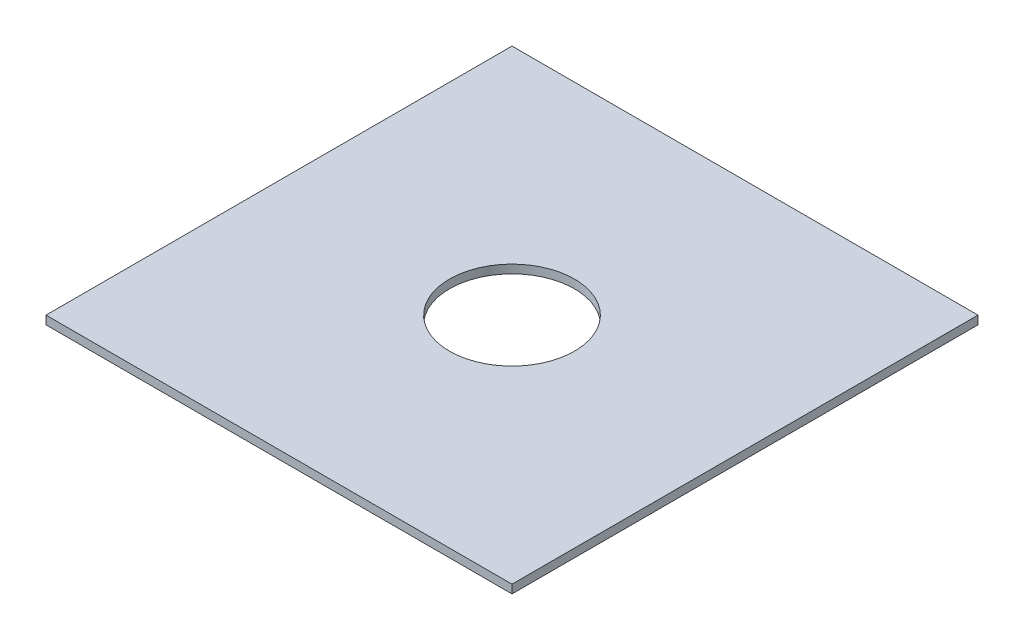
ISO-10303-21;
HEADER;
FILE_DESCRIPTION(('STEP AP214'),'2;1');
FILE_NAME('part.step','',(''),(''),'','','');
FILE_SCHEMA(('AUTOMOTIVE_DESIGN { 1 0 10303 214 1 1 1 1 }'));
ENDSEC;
DATA;
#1=APPLICATION_CONTEXT('core data for automotive mechanical design processes');
#2=APPLICATION_PROTOCOL_DEFINITION('international standard','automotive_design',2000,#1);
#3=PRODUCT_CONTEXT('',#1,'mechanical');
#4=PRODUCT('Part','Part','',(#3));
#5=PRODUCT_RELATED_PRODUCT_CATEGORY('part','',(#4));
#6=PRODUCT_DEFINITION_FORMATION('','',#4);
#7=PRODUCT_DEFINITION_CONTEXT('part definition',#1,'design');
#8=PRODUCT_DEFINITION('design','',#6,#7);
#9=PRODUCT_DEFINITION_SHAPE('','',#8);
#10=(LENGTH_UNIT() NAMED_UNIT(*) SI_UNIT(.MILLI.,.METRE.));
#11=(NAMED_UNIT(*) PLANE_ANGLE_UNIT() SI_UNIT($,.RADIAN.));
#12=(NAMED_UNIT(*) SI_UNIT($,.STERADIAN.) SOLID_ANGLE_UNIT());
#13=UNCERTAINTY_MEASURE_WITH_UNIT(LENGTH_MEASURE(1.E-05),#10,'distance_accuracy_value','');
#14=(GEOMETRIC_REPRESENTATION_CONTEXT(3) GLOBAL_UNCERTAINTY_ASSIGNED_CONTEXT((#13)) GLOBAL_UNIT_ASSIGNED_CONTEXT((#10,
#11,#12)) REPRESENTATION_CONTEXT('',''));
#15=CARTESIAN_POINT('',(0.,0.,0.));
#16=DIRECTION('',(0.,0.,1.));
#17=DIRECTION('',(1.,0.,0.));
#18=AXIS2_PLACEMENT_3D('',#15,#16,#17);
#19=CARTESIAN_POINT('',(55.,2.,-55.));
#20=DIRECTION('',(-1.,0.,0.));
#21=DIRECTION('',(0.,0.,1.));
#22=AXIS2_PLACEMENT_3D('',#19,#20,#21);
#23=PLANE('',#22);
#24=DIRECTION('',(0.,0.,-1.));
#25=VECTOR('',#24,1.);
#26=CARTESIAN_POINT('',(55.,0.,-55.));
#27=LINE('',#26,#25);
#28=CARTESIAN_POINT('',(55.,0.,55.));
#29=VERTEX_POINT('',#28);
#30=CARTESIAN_POINT('',(55.,0.,-55.));
#31=VERTEX_POINT('',#30);
#32=EDGE_CURVE('E107',#29,#31,#27,.T.);
#33=ORIENTED_EDGE('',*,*,#32,.T.);
#34=DIRECTION('',(0.,-1.,0.));
#35=VECTOR('',#34,1.);
#36=CARTESIAN_POINT('',(55.,2.,-55.));
#37=LINE('',#36,#35);
#38=CARTESIAN_POINT('',(55.,2.,-55.));
#39=VERTEX_POINT('',#38);
#40=EDGE_CURVE('E11',#39,#31,#37,.T.);
#41=ORIENTED_EDGE('',*,*,#40,.F.);
#42=DIRECTION('',(0.,0.,-1.));
#43=VECTOR('',#42,1.);
#44=CARTESIAN_POINT('',(55.,2.,-55.));
#45=LINE('',#44,#43);
#46=CARTESIAN_POINT('',(55.,2.,55.));
#47=VERTEX_POINT('',#46);
#48=EDGE_CURVE('E91',#47,#39,#45,.T.);
#49=ORIENTED_EDGE('',*,*,#48,.F.);
#50=DIRECTION('',(0.,-1.,0.));
#51=VECTOR('',#50,1.);
#52=CARTESIAN_POINT('',(55.,2.,55.));
#53=LINE('',#52,#51);
#54=EDGE_CURVE('E103',#47,#29,#53,.T.);
#55=ORIENTED_EDGE('',*,*,#54,.T.);
#56=EDGE_LOOP('',(#33,#41,#49,#55));
#57=FACE_BOUND('',#56,.T.);
#58=ADVANCED_FACE('F39',(#57),#23,.F.);
#59=CARTESIAN_POINT('',(-55.,2.,-55.));
#60=DIRECTION('',(0.,0.,1.));
#61=DIRECTION('',(1.,0.,0.));
#62=AXIS2_PLACEMENT_3D('',#59,#60,#61);
#63=PLANE('',#62);
#64=DIRECTION('',(-1.,0.,0.));
#65=VECTOR('',#64,1.);
#66=CARTESIAN_POINT('',(-55.,0.,-55.));
#67=LINE('',#66,#65);
#68=CARTESIAN_POINT('',(-55.,0.,-55.));
#69=VERTEX_POINT('',#68);
#70=EDGE_CURVE('E96',#31,#69,#67,.T.);
#71=ORIENTED_EDGE('',*,*,#70,.T.);
#72=DIRECTION('',(0.,-1.,0.));
#73=VECTOR('',#72,1.);
#74=CARTESIAN_POINT('',(-55.,2.,-55.));
#75=LINE('',#74,#73);
#76=CARTESIAN_POINT('',(-55.,2.,-55.));
#77=VERTEX_POINT('',#76);
#78=EDGE_CURVE('E48',#77,#69,#75,.T.);
#79=ORIENTED_EDGE('',*,*,#78,.F.);
#80=DIRECTION('',(-1.,0.,0.));
#81=VECTOR('',#80,1.);
#82=CARTESIAN_POINT('',(-55.,2.,-55.));
#83=LINE('',#82,#81);
#84=EDGE_CURVE('E86',#39,#77,#83,.T.);
#85=ORIENTED_EDGE('',*,*,#84,.F.);
#86=ORIENTED_EDGE('',*,*,#40,.T.);
#87=EDGE_LOOP('',(#71,#79,#85,#86));
#88=FACE_BOUND('',#87,.T.);
#89=ADVANCED_FACE('F95',(#88),#63,.F.);
#90=CARTESIAN_POINT('',(-55.,2.,-55.));
#91=DIRECTION('',(1.,0.,0.));
#92=DIRECTION('',(0.,0.,-1.));
#93=AXIS2_PLACEMENT_3D('',#90,#91,#92);
#94=PLANE('',#93);
#95=DIRECTION('',(0.,0.,1.));
#96=VECTOR('',#95,1.);
#97=CARTESIAN_POINT('',(-55.,0.,-55.));
#98=LINE('',#97,#96);
#99=CARTESIAN_POINT('',(-55.,0.,55.));
#100=VERTEX_POINT('',#99);
#101=EDGE_CURVE('E73',#69,#100,#98,.T.);
#102=ORIENTED_EDGE('',*,*,#101,.T.);
#103=DIRECTION('',(0.,-1.,0.));
#104=VECTOR('',#103,1.);
#105=CARTESIAN_POINT('',(-55.,2.,55.));
#106=LINE('',#105,#104);
#107=CARTESIAN_POINT('',(-55.,2.,55.));
#108=VERTEX_POINT('',#107);
#109=EDGE_CURVE('E98',#108,#100,#106,.T.);
#110=ORIENTED_EDGE('',*,*,#109,.F.);
#111=DIRECTION('',(0.,0.,1.));
#112=VECTOR('',#111,1.);
#113=CARTESIAN_POINT('',(-55.,2.,-55.));
#114=LINE('',#113,#112);
#115=EDGE_CURVE('E89',#77,#108,#114,.T.);
#116=ORIENTED_EDGE('',*,*,#115,.F.);
#117=ORIENTED_EDGE('',*,*,#78,.T.);
#118=EDGE_LOOP('',(#102,#110,#116,#117));
#119=FACE_BOUND('',#118,.T.);
#120=ADVANCED_FACE('F99',(#119),#94,.F.);
#121=CARTESIAN_POINT('',(-55.,2.,55.));
#122=DIRECTION('',(0.,0.,-1.));
#123=DIRECTION('',(-1.,0.,0.));
#124=AXIS2_PLACEMENT_3D('',#121,#122,#123);
#125=PLANE('',#124);
#126=DIRECTION('',(1.,0.,0.));
#127=VECTOR('',#126,1.);
#128=CARTESIAN_POINT('',(-55.,0.,55.));
#129=LINE('',#128,#127);
#130=EDGE_CURVE('E79',#100,#29,#129,.T.);
#131=ORIENTED_EDGE('',*,*,#130,.T.);
#132=ORIENTED_EDGE('',*,*,#54,.F.);
#133=DIRECTION('',(1.,0.,0.));
#134=VECTOR('',#133,1.);
#135=CARTESIAN_POINT('',(-55.,2.,55.));
#136=LINE('',#135,#134);
#137=EDGE_CURVE('E56',#108,#47,#136,.T.);
#138=ORIENTED_EDGE('',*,*,#137,.F.);
#139=ORIENTED_EDGE('',*,*,#109,.T.);
#140=EDGE_LOOP('',(#131,#132,#138,#139));
#141=FACE_BOUND('',#140,.T.);
#142=ADVANCED_FACE('F121',(#141),#125,.F.);
#143=CARTESIAN_POINT('',(0.,2.,0.));
#144=DIRECTION('',(0.,1.,0.));
#145=DIRECTION('',(0.,0.,1.));
#146=AXIS2_PLACEMENT_3D('',#143,#144,#145);
#147=PLANE('',#146);
#148=CARTESIAN_POINT('',(0.,2.,0.));
#149=DIRECTION('',(0.,1.,0.));
#150=DIRECTION('',(0.,0.,1.));
#151=AXIS2_PLACEMENT_3D('',#148,#149,#150);
#152=CIRCLE('',#151,14.7552621745085);
#153=CARTESIAN_POINT('',(0.,2.,14.7552621745085));
#154=VERTEX_POINT('',#153);
#155=EDGE_CURVE('E128',#154,#154,#152,.T.);
#156=ORIENTED_EDGE('',*,*,#155,.F.);
#157=EDGE_LOOP('',(#156));
#158=FACE_BOUND('',#157,.T.);
#159=ORIENTED_EDGE('',*,*,#48,.T.);
#160=ORIENTED_EDGE('',*,*,#84,.T.);
#161=ORIENTED_EDGE('',*,*,#115,.T.);
#162=ORIENTED_EDGE('',*,*,#137,.T.);
#163=EDGE_LOOP('',(#159,#160,#161,#162));
#164=FACE_BOUND('',#163,.T.);
#165=ADVANCED_FACE('F87',(#158,#164),#147,.T.);
#166=CARTESIAN_POINT('',(0.,0.,0.));
#167=DIRECTION('',(0.,1.,0.));
#168=DIRECTION('',(0.,0.,1.));
#169=AXIS2_PLACEMENT_3D('',#166,#167,#168);
#170=PLANE('',#169);
#171=CARTESIAN_POINT('',(0.,0.,0.));
#172=DIRECTION('',(0.,1.,0.));
#173=DIRECTION('',(0.,0.,1.));
#174=AXIS2_PLACEMENT_3D('',#171,#172,#173);
#175=CIRCLE('',#174,14.7552621745085);
#176=CARTESIAN_POINT('',(0.,0.,14.7552621745085));
#177=VERTEX_POINT('',#176);
#178=EDGE_CURVE('E111',#177,#177,#175,.T.);
#179=ORIENTED_EDGE('',*,*,#178,.T.);
#180=EDGE_LOOP('',(#179));
#181=FACE_BOUND('',#180,.T.);
#182=ORIENTED_EDGE('',*,*,#32,.F.);
#183=ORIENTED_EDGE('',*,*,#130,.F.);
#184=ORIENTED_EDGE('',*,*,#101,.F.);
#185=ORIENTED_EDGE('',*,*,#70,.F.);
#186=EDGE_LOOP('',(#182,#183,#184,#185));
#187=FACE_BOUND('',#186,.T.);
#188=ADVANCED_FACE('F124',(#181,#187),#170,.F.);
#189=CARTESIAN_POINT('',(0.,0.,0.));
#190=DIRECTION('',(0.,1.,0.));
#191=DIRECTION('',(0.,0.,1.));
#192=AXIS2_PLACEMENT_3D('',#189,#190,#191);
#193=CYLINDRICAL_SURFACE('',#192,14.7552621745085);
#194=ORIENTED_EDGE('',*,*,#178,.F.);
#195=EDGE_LOOP('',(#194));
#196=FACE_BOUND('',#195,.T.);
#197=ORIENTED_EDGE('',*,*,#155,.T.);
#198=EDGE_LOOP('',(#197));
#199=FACE_BOUND('',#198,.T.);
#200=ADVANCED_FACE('F137',(#196,#199),#193,.F.);
#201=CLOSED_SHELL('',(#58,#89,#120,#142,#165,#188,#200));
#202=MANIFOLD_SOLID_BREP('B2',#201);
#203=ADVANCED_BREP_SHAPE_REPRESENTATION('',(#18,#202),#14);
#204=SHAPE_DEFINITION_REPRESENTATION(#9,#203);
ENDSEC;
END-ISO-10303-21;
